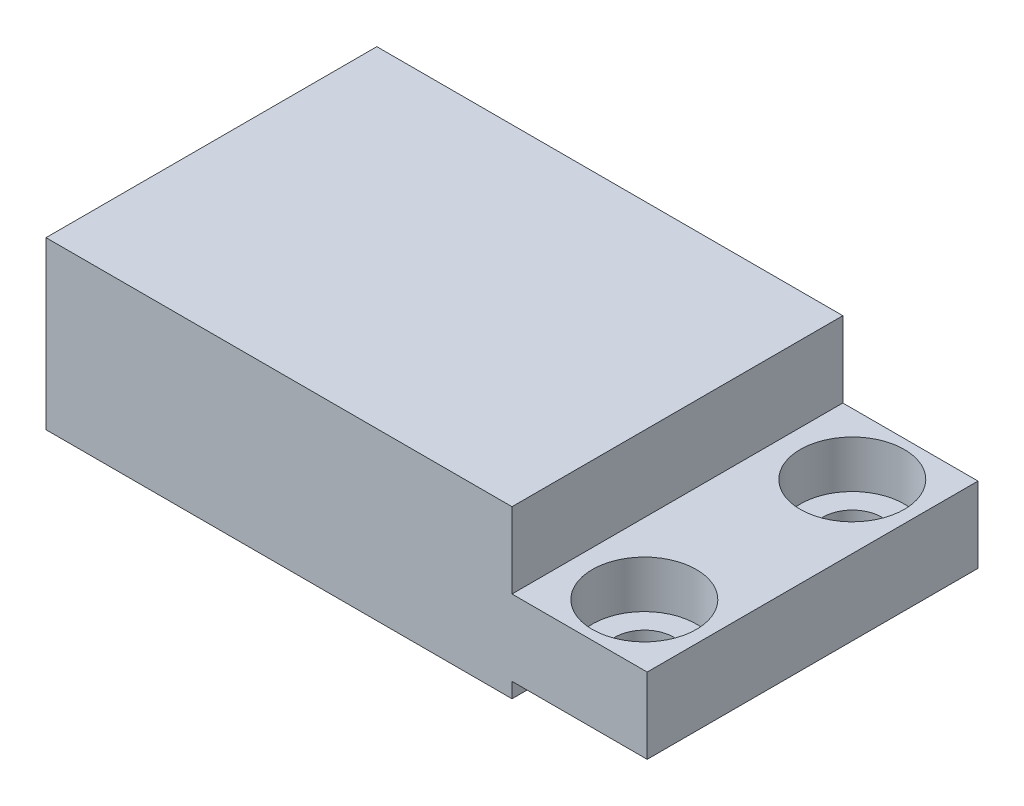
ISO-10303-21;
HEADER;
FILE_DESCRIPTION(('STEP AP214'),'2;1');
FILE_NAME('part.step','',(''),(''),'','','');
FILE_SCHEMA(('AUTOMOTIVE_DESIGN { 1 0 10303 214 1 1 1 1 }'));
ENDSEC;
DATA;
#1=APPLICATION_CONTEXT('core data for automotive mechanical design processes');
#2=APPLICATION_PROTOCOL_DEFINITION('international standard','automotive_design',2000,#1);
#3=PRODUCT_CONTEXT('',#1,'mechanical');
#4=PRODUCT('Part','Part','',(#3));
#5=PRODUCT_RELATED_PRODUCT_CATEGORY('part','',(#4));
#6=PRODUCT_DEFINITION_FORMATION('','',#4);
#7=PRODUCT_DEFINITION_CONTEXT('part definition',#1,'design');
#8=PRODUCT_DEFINITION('design','',#6,#7);
#9=PRODUCT_DEFINITION_SHAPE('','',#8);
#10=(LENGTH_UNIT() NAMED_UNIT(*) SI_UNIT(.MILLI.,.METRE.));
#11=(NAMED_UNIT(*) PLANE_ANGLE_UNIT() SI_UNIT($,.RADIAN.));
#12=(NAMED_UNIT(*) SI_UNIT($,.STERADIAN.) SOLID_ANGLE_UNIT());
#13=UNCERTAINTY_MEASURE_WITH_UNIT(LENGTH_MEASURE(1.E-05),#10,'distance_accuracy_value','');
#14=(GEOMETRIC_REPRESENTATION_CONTEXT(3) GLOBAL_UNCERTAINTY_ASSIGNED_CONTEXT((#13)) GLOBAL_UNIT_ASSIGNED_CONTEXT((#10,
#11,#12)) REPRESENTATION_CONTEXT('',''));
#15=CARTESIAN_POINT('',(0.,0.,0.));
#16=DIRECTION('',(0.,0.,1.));
#17=DIRECTION('',(1.,0.,0.));
#18=AXIS2_PLACEMENT_3D('',#15,#16,#17);
#19=CARTESIAN_POINT('',(-15.9,0.,8.75));
#20=DIRECTION('',(1.,0.,0.));
#21=DIRECTION('',(0.,0.,-1.));
#22=AXIS2_PLACEMENT_3D('',#19,#20,#21);
#23=PLANE('',#22);
#24=DIRECTION('',(0.,-1.,0.));
#25=VECTOR('',#24,1.);
#26=CARTESIAN_POINT('',(-15.9,0.,-8.75));
#27=LINE('',#26,#25);
#28=CARTESIAN_POINT('',(-15.9,8.8,-8.75));
#29=VERTEX_POINT('',#28);
#30=CARTESIAN_POINT('',(-15.9,0.,-8.75));
#31=VERTEX_POINT('',#30);
#32=EDGE_CURVE('E143',#29,#31,#27,.T.);
#33=ORIENTED_EDGE('',*,*,#32,.T.);
#34=DIRECTION('',(0.,0.,-1.));
#35=VECTOR('',#34,1.);
#36=CARTESIAN_POINT('',(-15.9,0.,8.75));
#37=LINE('',#36,#35);
#38=CARTESIAN_POINT('',(-15.9,0.,8.75));
#39=VERTEX_POINT('',#38);
#40=EDGE_CURVE('E11',#39,#31,#37,.T.);
#41=ORIENTED_EDGE('',*,*,#40,.F.);
#42=DIRECTION('',(0.,-1.,0.));
#43=VECTOR('',#42,1.);
#44=CARTESIAN_POINT('',(-15.9,0.,8.75));
#45=LINE('',#44,#43);
#46=CARTESIAN_POINT('',(-15.9,8.8,8.75));
#47=VERTEX_POINT('',#46);
#48=EDGE_CURVE('E145',#47,#39,#45,.T.);
#49=ORIENTED_EDGE('',*,*,#48,.F.);
#50=DIRECTION('',(0.,0.,-1.));
#51=VECTOR('',#50,1.);
#52=CARTESIAN_POINT('',(-15.9,8.8,8.75));
#53=LINE('',#52,#51);
#54=EDGE_CURVE('E41',#47,#29,#53,.T.);
#55=ORIENTED_EDGE('',*,*,#54,.T.);
#56=EDGE_LOOP('',(#33,#41,#49,#55));
#57=FACE_BOUND('',#56,.T.);
#58=ADVANCED_FACE('F33',(#57),#23,.F.);
#59=CARTESIAN_POINT('',(-15.9,0.,8.75));
#60=DIRECTION('',(0.,1.,0.));
#61=DIRECTION('',(0.,0.,1.));
#62=AXIS2_PLACEMENT_3D('',#59,#60,#61);
#63=PLANE('',#62);
#64=DIRECTION('',(1.,0.,0.));
#65=VECTOR('',#64,1.);
#66=CARTESIAN_POINT('',(-15.9,0.,-8.75));
#67=LINE('',#66,#65);
#68=CARTESIAN_POINT('',(8.75,0.,-8.75));
#69=VERTEX_POINT('',#68);
#70=EDGE_CURVE('E158',#31,#69,#67,.T.);
#71=ORIENTED_EDGE('',*,*,#70,.T.);
#72=DIRECTION('',(0.,0.,-1.));
#73=VECTOR('',#72,1.);
#74=CARTESIAN_POINT('',(8.75,0.,8.75));
#75=LINE('',#74,#73);
#76=CARTESIAN_POINT('',(8.75,0.,8.75));
#77=VERTEX_POINT('',#76);
#78=EDGE_CURVE('E129',#77,#69,#75,.T.);
#79=ORIENTED_EDGE('',*,*,#78,.F.);
#80=DIRECTION('',(1.,0.,0.));
#81=VECTOR('',#80,1.);
#82=CARTESIAN_POINT('',(-15.9,0.,8.75));
#83=LINE('',#82,#81);
#84=EDGE_CURVE('E148',#39,#77,#83,.T.);
#85=ORIENTED_EDGE('',*,*,#84,.F.);
#86=ORIENTED_EDGE('',*,*,#40,.T.);
#87=EDGE_LOOP('',(#71,#79,#85,#86));
#88=FACE_BOUND('',#87,.T.);
#89=ADVANCED_FACE('F213',(#88),#63,.F.);
#90=CARTESIAN_POINT('',(15.9,0.,8.75));
#91=DIRECTION('',(-1.,0.,0.));
#92=DIRECTION('',(0.,0.,1.));
#93=AXIS2_PLACEMENT_3D('',#90,#91,#92);
#94=PLANE('',#93);
#95=DIRECTION('',(0.,1.,0.));
#96=VECTOR('',#95,1.);
#97=CARTESIAN_POINT('',(15.9,0.,-8.75));
#98=LINE('',#97,#96);
#99=CARTESIAN_POINT('',(15.9,0.8,-8.75));
#100=VERTEX_POINT('',#99);
#101=CARTESIAN_POINT('',(15.9,4.8,-8.75));
#102=VERTEX_POINT('',#101);
#103=EDGE_CURVE('E161',#100,#102,#98,.T.);
#104=ORIENTED_EDGE('',*,*,#103,.T.);
#105=DIRECTION('',(0.,0.,1.));
#106=VECTOR('',#105,1.);
#107=CARTESIAN_POINT('',(15.9,4.8,-8.75));
#108=LINE('',#107,#106);
#109=CARTESIAN_POINT('',(15.9,4.8,8.75));
#110=VERTEX_POINT('',#109);
#111=EDGE_CURVE('E49',#102,#110,#108,.T.);
#112=ORIENTED_EDGE('',*,*,#111,.T.);
#113=DIRECTION('',(0.,1.,0.));
#114=VECTOR('',#113,1.);
#115=CARTESIAN_POINT('',(15.9,0.,8.75));
#116=LINE('',#115,#114);
#117=CARTESIAN_POINT('',(15.9,0.8,8.75));
#118=VERTEX_POINT('',#117);
#119=EDGE_CURVE('E151',#118,#110,#116,.T.);
#120=ORIENTED_EDGE('',*,*,#119,.F.);
#121=DIRECTION('',(0.,0.,1.));
#122=VECTOR('',#121,1.);
#123=CARTESIAN_POINT('',(15.9,0.8,8.75));
#124=LINE('',#123,#122);
#125=EDGE_CURVE('E131',#100,#118,#124,.T.);
#126=ORIENTED_EDGE('',*,*,#125,.F.);
#127=EDGE_LOOP('',(#104,#112,#120,#126));
#128=FACE_BOUND('',#127,.T.);
#129=ADVANCED_FACE('F218',(#128),#94,.F.);
#130=CARTESIAN_POINT('',(-15.9,8.8,8.75));
#131=DIRECTION('',(0.,-1.,0.));
#132=DIRECTION('',(0.,0.,-1.));
#133=AXIS2_PLACEMENT_3D('',#130,#131,#132);
#134=PLANE('',#133);
#135=DIRECTION('',(-1.,0.,0.));
#136=VECTOR('',#135,1.);
#137=CARTESIAN_POINT('',(-15.9,8.8,8.75));
#138=LINE('',#137,#136);
#139=CARTESIAN_POINT('',(8.75,8.8,8.75));
#140=VERTEX_POINT('',#139);
#141=EDGE_CURVE('E154',#140,#47,#138,.T.);
#142=ORIENTED_EDGE('',*,*,#141,.F.);
#143=DIRECTION('',(0.,0.,1.));
#144=VECTOR('',#143,1.);
#145=CARTESIAN_POINT('',(8.75,8.8,-8.75));
#146=LINE('',#145,#144);
#147=CARTESIAN_POINT('',(8.75,8.8,-8.75));
#148=VERTEX_POINT('',#147);
#149=EDGE_CURVE('E127',#148,#140,#146,.T.);
#150=ORIENTED_EDGE('',*,*,#149,.F.);
#151=DIRECTION('',(-1.,0.,0.));
#152=VECTOR('',#151,1.);
#153=CARTESIAN_POINT('',(-15.9,8.8,-8.75));
#154=LINE('',#153,#152);
#155=EDGE_CURVE('E117',#148,#29,#154,.T.);
#156=ORIENTED_EDGE('',*,*,#155,.T.);
#157=ORIENTED_EDGE('',*,*,#54,.F.);
#158=EDGE_LOOP('',(#142,#150,#156,#157));
#159=FACE_BOUND('',#158,.T.);
#160=ADVANCED_FACE('F230',(#159),#134,.F.);
#161=CARTESIAN_POINT('',(0.,0.,8.75));
#162=DIRECTION('',(0.,0.,-1.));
#163=DIRECTION('',(-1.,0.,0.));
#164=AXIS2_PLACEMENT_3D('',#161,#162,#163);
#165=PLANE('',#164);
#166=DIRECTION('',(1.,0.,0.));
#167=VECTOR('',#166,1.);
#168=CARTESIAN_POINT('',(8.75,4.8,8.75));
#169=LINE('',#168,#167);
#170=CARTESIAN_POINT('',(8.75,4.8,8.75));
#171=VERTEX_POINT('',#170);
#172=EDGE_CURVE('E118',#171,#110,#169,.T.);
#173=ORIENTED_EDGE('',*,*,#172,.F.);
#174=DIRECTION('',(0.,-1.,0.));
#175=VECTOR('',#174,1.);
#176=CARTESIAN_POINT('',(8.75,8.8,8.75));
#177=LINE('',#176,#175);
#178=EDGE_CURVE('E105',#140,#171,#177,.T.);
#179=ORIENTED_EDGE('',*,*,#178,.F.);
#180=ORIENTED_EDGE('',*,*,#141,.T.);
#181=ORIENTED_EDGE('',*,*,#48,.T.);
#182=ORIENTED_EDGE('',*,*,#84,.T.);
#183=DIRECTION('',(0.,-1.,0.));
#184=VECTOR('',#183,1.);
#185=CARTESIAN_POINT('',(8.75,0.8,8.75));
#186=LINE('',#185,#184);
#187=CARTESIAN_POINT('',(8.75,0.8,8.75));
#188=VERTEX_POINT('',#187);
#189=EDGE_CURVE('E138',#188,#77,#186,.T.);
#190=ORIENTED_EDGE('',*,*,#189,.F.);
#191=DIRECTION('',(-1.,0.,0.));
#192=VECTOR('',#191,1.);
#193=CARTESIAN_POINT('',(15.9,0.8,8.75));
#194=LINE('',#193,#192);
#195=EDGE_CURVE('E133',#118,#188,#194,.T.);
#196=ORIENTED_EDGE('',*,*,#195,.F.);
#197=ORIENTED_EDGE('',*,*,#119,.T.);
#198=EDGE_LOOP('',(#173,#179,#180,#181,#182,#190,#196,#197));
#199=FACE_BOUND('',#198,.T.);
#200=ADVANCED_FACE('F227',(#199),#165,.F.);
#201=CARTESIAN_POINT('',(0.,0.,-8.75));
#202=DIRECTION('',(0.,0.,-1.));
#203=DIRECTION('',(-1.,0.,0.));
#204=AXIS2_PLACEMENT_3D('',#201,#202,#203);
#205=PLANE('',#204);
#206=DIRECTION('',(0.,-1.,0.));
#207=VECTOR('',#206,1.);
#208=CARTESIAN_POINT('',(8.75,8.8,-8.75));
#209=LINE('',#208,#207);
#210=CARTESIAN_POINT('',(8.75,4.8,-8.75));
#211=VERTEX_POINT('',#210);
#212=EDGE_CURVE('E102',#148,#211,#209,.T.);
#213=ORIENTED_EDGE('',*,*,#212,.T.);
#214=DIRECTION('',(1.,0.,0.));
#215=VECTOR('',#214,1.);
#216=CARTESIAN_POINT('',(8.75,4.8,-8.75));
#217=LINE('',#216,#215);
#218=EDGE_CURVE('E107',#211,#102,#217,.T.);
#219=ORIENTED_EDGE('',*,*,#218,.T.);
#220=ORIENTED_EDGE('',*,*,#103,.F.);
#221=DIRECTION('',(1.,0.,0.));
#222=VECTOR('',#221,1.);
#223=CARTESIAN_POINT('',(15.9,0.8,-8.75));
#224=LINE('',#223,#222);
#225=CARTESIAN_POINT('',(8.75,0.8,-8.75));
#226=VERTEX_POINT('',#225);
#227=EDGE_CURVE('E136',#226,#100,#224,.T.);
#228=ORIENTED_EDGE('',*,*,#227,.F.);
#229=DIRECTION('',(0.,-1.,0.));
#230=VECTOR('',#229,1.);
#231=CARTESIAN_POINT('',(8.75,0.8,-8.75));
#232=LINE('',#231,#230);
#233=EDGE_CURVE('E140',#226,#69,#232,.T.);
#234=ORIENTED_EDGE('',*,*,#233,.T.);
#235=ORIENTED_EDGE('',*,*,#70,.F.);
#236=ORIENTED_EDGE('',*,*,#32,.F.);
#237=ORIENTED_EDGE('',*,*,#155,.F.);
#238=EDGE_LOOP('',(#213,#219,#220,#228,#234,#235,#236,#237));
#239=FACE_BOUND('',#238,.T.);
#240=ADVANCED_FACE('F115',(#239),#205,.T.);
#241=CARTESIAN_POINT('',(8.75,0.8,8.75));
#242=DIRECTION('',(-1.,0.,0.));
#243=DIRECTION('',(0.,0.,1.));
#244=AXIS2_PLACEMENT_3D('',#241,#242,#243);
#245=PLANE('',#244);
#246=ORIENTED_EDGE('',*,*,#78,.T.);
#247=ORIENTED_EDGE('',*,*,#233,.F.);
#248=DIRECTION('',(0.,0.,-1.));
#249=VECTOR('',#248,1.);
#250=CARTESIAN_POINT('',(8.75,0.8,8.75));
#251=LINE('',#250,#249);
#252=EDGE_CURVE('E57',#188,#226,#251,.T.);
#253=ORIENTED_EDGE('',*,*,#252,.F.);
#254=ORIENTED_EDGE('',*,*,#189,.T.);
#255=EDGE_LOOP('',(#246,#247,#253,#254));
#256=FACE_BOUND('',#255,.T.);
#257=ADVANCED_FACE('F242',(#256),#245,.F.);
#258=CARTESIAN_POINT('',(0.,0.8,0.));
#259=DIRECTION('',(0.,1.,0.));
#260=DIRECTION('',(0.,0.,1.));
#261=AXIS2_PLACEMENT_3D('',#258,#259,#260);
#262=PLANE('',#261);
#263=CARTESIAN_POINT('',(12.5,0.8,-5.5));
#264=DIRECTION('',(0.,1.,0.));
#265=DIRECTION('',(0.,0.,1.));
#266=AXIS2_PLACEMENT_3D('',#263,#264,#265);
#267=CIRCLE('',#266,1.55);
#268=CARTESIAN_POINT('',(12.5,0.8,-3.95));
#269=VERTEX_POINT('',#268);
#270=EDGE_CURVE('E36',#269,#269,#267,.T.);
#271=ORIENTED_EDGE('',*,*,#270,.T.);
#272=EDGE_LOOP('',(#271));
#273=FACE_BOUND('',#272,.T.);
#274=CARTESIAN_POINT('',(12.5,0.8,5.5));
#275=DIRECTION('',(0.,1.,0.));
#276=DIRECTION('',(0.,0.,1.));
#277=AXIS2_PLACEMENT_3D('',#274,#275,#276);
#278=CIRCLE('',#277,1.55);
#279=CARTESIAN_POINT('',(12.5,0.8,7.05));
#280=VERTEX_POINT('',#279);
#281=EDGE_CURVE('E125',#280,#280,#278,.T.);
#282=ORIENTED_EDGE('',*,*,#281,.T.);
#283=EDGE_LOOP('',(#282));
#284=FACE_BOUND('',#283,.T.);
#285=ORIENTED_EDGE('',*,*,#125,.T.);
#286=ORIENTED_EDGE('',*,*,#195,.T.);
#287=ORIENTED_EDGE('',*,*,#252,.T.);
#288=ORIENTED_EDGE('',*,*,#227,.T.);
#289=EDGE_LOOP('',(#285,#286,#287,#288));
#290=FACE_BOUND('',#289,.T.);
#291=ADVANCED_FACE('F246',(#273,#284,#290),#262,.F.);
#292=CARTESIAN_POINT('',(8.75,8.8,-8.75));
#293=DIRECTION('',(-1.,0.,0.));
#294=DIRECTION('',(0.,0.,1.));
#295=AXIS2_PLACEMENT_3D('',#292,#293,#294);
#296=PLANE('',#295);
#297=ORIENTED_EDGE('',*,*,#178,.T.);
#298=DIRECTION('',(0.,0.,1.));
#299=VECTOR('',#298,1.);
#300=CARTESIAN_POINT('',(8.75,4.8,-8.75));
#301=LINE('',#300,#299);
#302=EDGE_CURVE('E99',#211,#171,#301,.T.);
#303=ORIENTED_EDGE('',*,*,#302,.F.);
#304=ORIENTED_EDGE('',*,*,#212,.F.);
#305=ORIENTED_EDGE('',*,*,#149,.T.);
#306=EDGE_LOOP('',(#297,#303,#304,#305));
#307=FACE_BOUND('',#306,.T.);
#308=ADVANCED_FACE('F100',(#307),#296,.F.);
#309=CARTESIAN_POINT('',(8.75,4.8,-8.75));
#310=DIRECTION('',(0.,-1.,0.));
#311=DIRECTION('',(0.,0.,-1.));
#312=AXIS2_PLACEMENT_3D('',#309,#310,#311);
#313=PLANE('',#312);
#314=CARTESIAN_POINT('',(12.5,4.8,-5.5));
#315=DIRECTION('',(0.,1.,0.));
#316=DIRECTION('',(0.,0.,1.));
#317=AXIS2_PLACEMENT_3D('',#314,#315,#316);
#318=CIRCLE('',#317,2.75);
#319=CARTESIAN_POINT('',(12.5,4.8,-2.75));
#320=VERTEX_POINT('',#319);
#321=EDGE_CURVE('E185',#320,#320,#318,.T.);
#322=ORIENTED_EDGE('',*,*,#321,.F.);
#323=EDGE_LOOP('',(#322));
#324=FACE_BOUND('',#323,.T.);
#325=CARTESIAN_POINT('',(12.5,4.8,5.5));
#326=DIRECTION('',(0.,1.,0.));
#327=DIRECTION('',(0.,0.,1.));
#328=AXIS2_PLACEMENT_3D('',#325,#326,#327);
#329=CIRCLE('',#328,2.75);
#330=CARTESIAN_POINT('',(12.5,4.8,8.25));
#331=VERTEX_POINT('',#330);
#332=EDGE_CURVE('E173',#331,#331,#329,.T.);
#333=ORIENTED_EDGE('',*,*,#332,.F.);
#334=EDGE_LOOP('',(#333));
#335=FACE_BOUND('',#334,.T.);
#336=ORIENTED_EDGE('',*,*,#172,.T.);
#337=ORIENTED_EDGE('',*,*,#111,.F.);
#338=ORIENTED_EDGE('',*,*,#218,.F.);
#339=ORIENTED_EDGE('',*,*,#302,.T.);
#340=EDGE_LOOP('',(#336,#337,#338,#339));
#341=FACE_BOUND('',#340,.T.);
#342=ADVANCED_FACE('F109',(#324,#335,#341),#313,.F.);
#343=CARTESIAN_POINT('',(12.5,4.8,5.5));
#344=DIRECTION('',(0.,1.,0.));
#345=DIRECTION('',(0.,0.,1.));
#346=AXIS2_PLACEMENT_3D('',#343,#344,#345);
#347=CYLINDRICAL_SURFACE('',#346,1.55);
#348=CARTESIAN_POINT('',(12.5,2.3,5.5));
#349=DIRECTION('',(0.,1.,0.));
#350=DIRECTION('',(0.,0.,1.));
#351=AXIS2_PLACEMENT_3D('',#348,#349,#350);
#352=CIRCLE('',#351,1.55);
#353=CARTESIAN_POINT('',(12.5,2.3,7.05));
#354=VERTEX_POINT('',#353);
#355=EDGE_CURVE('E122',#354,#354,#352,.T.);
#356=ORIENTED_EDGE('',*,*,#355,.T.);
#357=EDGE_LOOP('',(#356));
#358=FACE_BOUND('',#357,.T.);
#359=ORIENTED_EDGE('',*,*,#281,.F.);
#360=EDGE_LOOP('',(#359));
#361=FACE_BOUND('',#360,.T.);
#362=ADVANCED_FACE('F193',(#358,#361),#347,.F.);
#363=CARTESIAN_POINT('',(14.05,2.3,5.5));
#364=DIRECTION('',(0.,-1.,0.));
#365=DIRECTION('',(0.,0.,-1.));
#366=AXIS2_PLACEMENT_3D('',#363,#364,#365);
#367=PLANE('',#366);
#368=ORIENTED_EDGE('',*,*,#355,.F.);
#369=EDGE_LOOP('',(#368));
#370=FACE_BOUND('',#369,.T.);
#371=CARTESIAN_POINT('',(12.5,2.3,5.5));
#372=DIRECTION('',(0.,1.,0.));
#373=DIRECTION('',(0.,0.,1.));
#374=AXIS2_PLACEMENT_3D('',#371,#372,#373);
#375=CIRCLE('',#374,2.75);
#376=CARTESIAN_POINT('',(12.5,2.3,8.25));
#377=VERTEX_POINT('',#376);
#378=EDGE_CURVE('E169',#377,#377,#375,.T.);
#379=ORIENTED_EDGE('',*,*,#378,.T.);
#380=EDGE_LOOP('',(#379));
#381=FACE_BOUND('',#380,.T.);
#382=ADVANCED_FACE('F200',(#370,#381),#367,.F.);
#383=CARTESIAN_POINT('',(12.5,4.8,5.5));
#384=DIRECTION('',(0.,1.,0.));
#385=DIRECTION('',(0.,0.,1.));
#386=AXIS2_PLACEMENT_3D('',#383,#384,#385);
#387=CYLINDRICAL_SURFACE('',#386,2.75);
#388=ORIENTED_EDGE('',*,*,#378,.F.);
#389=EDGE_LOOP('',(#388));
#390=FACE_BOUND('',#389,.T.);
#391=ORIENTED_EDGE('',*,*,#332,.T.);
#392=EDGE_LOOP('',(#391));
#393=FACE_BOUND('',#392,.T.);
#394=ADVANCED_FACE('F197',(#390,#393),#387,.F.);
#395=CARTESIAN_POINT('',(12.5,4.8,-5.5));
#396=DIRECTION('',(0.,1.,0.));
#397=DIRECTION('',(0.,0.,1.));
#398=AXIS2_PLACEMENT_3D('',#395,#396,#397);
#399=CYLINDRICAL_SURFACE('',#398,1.55);
#400=CARTESIAN_POINT('',(12.5,2.3,-5.5));
#401=DIRECTION('',(0.,1.,0.));
#402=DIRECTION('',(0.,0.,1.));
#403=AXIS2_PLACEMENT_3D('',#400,#401,#402);
#404=CIRCLE('',#403,1.55);
#405=CARTESIAN_POINT('',(12.5,2.3,-3.95));
#406=VERTEX_POINT('',#405);
#407=EDGE_CURVE('E179',#406,#406,#404,.T.);
#408=ORIENTED_EDGE('',*,*,#407,.T.);
#409=EDGE_LOOP('',(#408));
#410=FACE_BOUND('',#409,.T.);
#411=ORIENTED_EDGE('',*,*,#270,.F.);
#412=EDGE_LOOP('',(#411));
#413=FACE_BOUND('',#412,.T.);
#414=ADVANCED_FACE('F199',(#410,#413),#399,.F.);
#415=CARTESIAN_POINT('',(14.05,2.3,-5.5));
#416=DIRECTION('',(0.,-1.,0.));
#417=DIRECTION('',(0.,0.,-1.));
#418=AXIS2_PLACEMENT_3D('',#415,#416,#417);
#419=PLANE('',#418);
#420=ORIENTED_EDGE('',*,*,#407,.F.);
#421=EDGE_LOOP('',(#420));
#422=FACE_BOUND('',#421,.T.);
#423=CARTESIAN_POINT('',(12.5,2.3,-5.5));
#424=DIRECTION('',(0.,1.,0.));
#425=DIRECTION('',(0.,0.,1.));
#426=AXIS2_PLACEMENT_3D('',#423,#424,#425);
#427=CIRCLE('',#426,2.75);
#428=CARTESIAN_POINT('',(12.5,2.3,-2.75));
#429=VERTEX_POINT('',#428);
#430=EDGE_CURVE('E182',#429,#429,#427,.T.);
#431=ORIENTED_EDGE('',*,*,#430,.T.);
#432=EDGE_LOOP('',(#431));
#433=FACE_BOUND('',#432,.T.);
#434=ADVANCED_FACE('F207',(#422,#433),#419,.F.);
#435=CARTESIAN_POINT('',(12.5,4.8,-5.5));
#436=DIRECTION('',(0.,1.,0.));
#437=DIRECTION('',(0.,0.,1.));
#438=AXIS2_PLACEMENT_3D('',#435,#436,#437);
#439=CYLINDRICAL_SURFACE('',#438,2.75);
#440=ORIENTED_EDGE('',*,*,#430,.F.);
#441=EDGE_LOOP('',(#440));
#442=FACE_BOUND('',#441,.T.);
#443=ORIENTED_EDGE('',*,*,#321,.T.);
#444=EDGE_LOOP('',(#443));
#445=FACE_BOUND('',#444,.T.);
#446=ADVANCED_FACE('F189',(#442,#445),#439,.F.);
#447=CLOSED_SHELL('',(#58,#89,#129,#160,#200,#240,#257,#291,#308,#342,#362,#382,#394,#414,#434,#446));
#448=MANIFOLD_SOLID_BREP('B2',#447);
#449=ADVANCED_BREP_SHAPE_REPRESENTATION('',(#18,#448),#14);
#450=SHAPE_DEFINITION_REPRESENTATION(#9,#449);
ENDSEC;
END-ISO-10303-21;
